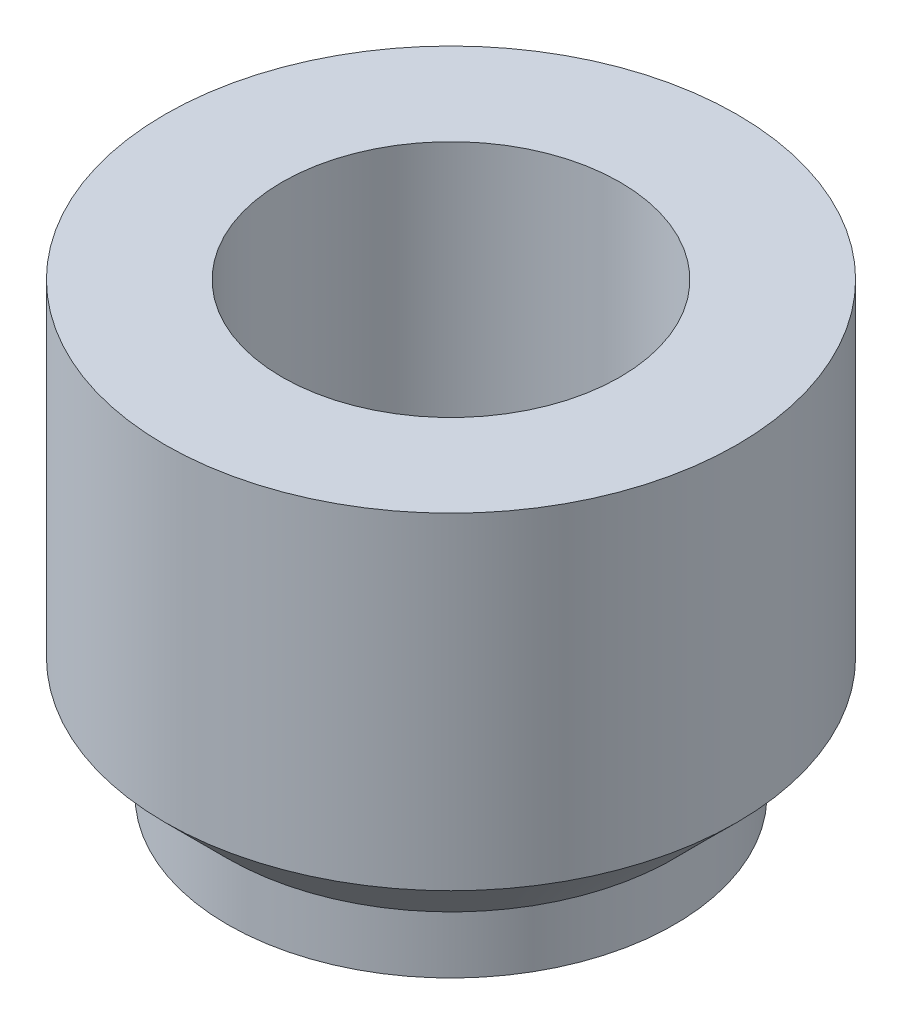
ISO-10303-21;
HEADER;
FILE_DESCRIPTION(('STEP AP214'),'2;1');
FILE_NAME('part.step','',(''),(''),'','','');
FILE_SCHEMA(('AUTOMOTIVE_DESIGN { 1 0 10303 214 1 1 1 1 }'));
ENDSEC;
DATA;
#1=APPLICATION_CONTEXT('core data for automotive mechanical design processes');
#2=APPLICATION_PROTOCOL_DEFINITION('international standard','automotive_design',2000,#1);
#3=PRODUCT_CONTEXT('',#1,'mechanical');
#4=PRODUCT('Part','Part','',(#3));
#5=PRODUCT_RELATED_PRODUCT_CATEGORY('part','',(#4));
#6=PRODUCT_DEFINITION_FORMATION('','',#4);
#7=PRODUCT_DEFINITION_CONTEXT('part definition',#1,'design');
#8=PRODUCT_DEFINITION('design','',#6,#7);
#9=PRODUCT_DEFINITION_SHAPE('','',#8);
#10=(LENGTH_UNIT() NAMED_UNIT(*) SI_UNIT(.MILLI.,.METRE.));
#11=(NAMED_UNIT(*) PLANE_ANGLE_UNIT() SI_UNIT($,.RADIAN.));
#12=(NAMED_UNIT(*) SI_UNIT($,.STERADIAN.) SOLID_ANGLE_UNIT());
#13=UNCERTAINTY_MEASURE_WITH_UNIT(LENGTH_MEASURE(1.E-05),#10,'distance_accuracy_value','');
#14=(GEOMETRIC_REPRESENTATION_CONTEXT(3) GLOBAL_UNCERTAINTY_ASSIGNED_CONTEXT((#13)) GLOBAL_UNIT_ASSIGNED_CONTEXT((#10,
#11,#12)) REPRESENTATION_CONTEXT('',''));
#15=CARTESIAN_POINT('',(0.,0.,0.));
#16=DIRECTION('',(0.,0.,1.));
#17=DIRECTION('',(1.,0.,0.));
#18=AXIS2_PLACEMENT_3D('',#15,#16,#17);
#19=CARTESIAN_POINT('',(0.,0.,0.));
#20=DIRECTION('',(0.,1.,0.));
#21=DIRECTION('',(0.,0.,1.));
#22=AXIS2_PLACEMENT_3D('',#19,#20,#21);
#23=PLANE('',#22);
#24=CARTESIAN_POINT('',(0.,0.,0.));
#25=DIRECTION('',(0.,1.,0.));
#26=DIRECTION('',(0.,0.,1.));
#27=AXIS2_PLACEMENT_3D('',#24,#25,#26);
#28=CIRCLE('',#27,4.1);
#29=CARTESIAN_POINT('',(0.,0.,4.1));
#30=VERTEX_POINT('',#29);
#31=EDGE_CURVE('E59',#30,#30,#28,.T.);
#32=ORIENTED_EDGE('',*,*,#31,.F.);
#33=EDGE_LOOP('',(#32));
#34=FACE_BOUND('',#33,.T.);
#35=CARTESIAN_POINT('',(0.,0.,0.));
#36=DIRECTION('',(0.,1.,0.));
#37=DIRECTION('',(0.,0.,1.));
#38=AXIS2_PLACEMENT_3D('',#35,#36,#37);
#39=CIRCLE('',#38,2.1);
#40=CARTESIAN_POINT('',(0.,0.,2.1));
#41=VERTEX_POINT('',#40);
#42=EDGE_CURVE('E64',#41,#41,#39,.T.);
#43=ORIENTED_EDGE('',*,*,#42,.T.);
#44=EDGE_LOOP('',(#43));
#45=FACE_BOUND('',#44,.T.);
#46=ADVANCED_FACE('F45',(#34,#45),#23,.F.);
#47=CARTESIAN_POINT('',(0.,2.2,0.));
#48=DIRECTION('',(0.,-1.,0.));
#49=DIRECTION('',(0.,0.,-1.));
#50=AXIS2_PLACEMENT_3D('',#47,#48,#49);
#51=CYLINDRICAL_SURFACE('',#50,4.1);
#52=CARTESIAN_POINT('',(0.,1.05,0.));
#53=DIRECTION('',(0.,1.,0.));
#54=DIRECTION('',(0.,0.,1.));
#55=AXIS2_PLACEMENT_3D('',#52,#53,#54);
#56=CIRCLE('',#55,4.1);
#57=CARTESIAN_POINT('',(0.,1.05,4.1));
#58=VERTEX_POINT('',#57);
#59=EDGE_CURVE('E10',#58,#58,#56,.F.);
#60=ORIENTED_EDGE('',*,*,#59,.T.);
#61=EDGE_LOOP('',(#60));
#62=FACE_BOUND('',#61,.T.);
#63=ORIENTED_EDGE('',*,*,#31,.T.);
#64=EDGE_LOOP('',(#63));
#65=FACE_BOUND('',#64,.T.);
#66=ADVANCED_FACE('F105',(#62,#65),#51,.T.);
#67=CARTESIAN_POINT('',(0.,2.2,0.));
#68=DIRECTION('',(0.,-1.,0.));
#69=DIRECTION('',(0.,0.,-1.));
#70=AXIS2_PLACEMENT_3D('',#67,#68,#69);
#71=CYLINDRICAL_SURFACE('',#70,2.1);
#72=CARTESIAN_POINT('',(0.,2.2,0.));
#73=DIRECTION('',(0.,1.,0.));
#74=DIRECTION('',(0.,0.,1.));
#75=AXIS2_PLACEMENT_3D('',#72,#73,#74);
#76=CIRCLE('',#75,2.1);
#77=CARTESIAN_POINT('',(0.,2.2,2.1));
#78=VERTEX_POINT('',#77);
#79=EDGE_CURVE('E70',#78,#78,#76,.T.);
#80=ORIENTED_EDGE('',*,*,#79,.T.);
#81=EDGE_LOOP('',(#80));
#82=FACE_BOUND('',#81,.T.);
#83=ORIENTED_EDGE('',*,*,#42,.F.);
#84=EDGE_LOOP('',(#83));
#85=FACE_BOUND('',#84,.T.);
#86=ADVANCED_FACE('F112',(#82,#85),#71,.F.);
#87=CARTESIAN_POINT('',(0.,2.2,0.));
#88=DIRECTION('',(0.,1.,0.));
#89=DIRECTION('',(0.,0.,1.));
#90=AXIS2_PLACEMENT_3D('',#87,#88,#89);
#91=PLANE('',#90);
#92=ORIENTED_EDGE('',*,*,#79,.F.);
#93=EDGE_LOOP('',(#92));
#94=FACE_BOUND('',#93,.T.);
#95=ADVANCED_FACE('F100',(#94),#91,.F.);
#96=CARTESIAN_POINT('',(0.,3.2,0.));
#97=DIRECTION('',(0.,-1.,0.));
#98=DIRECTION('',(0.,0.,-1.));
#99=AXIS2_PLACEMENT_3D('',#96,#97,#98);
#100=CYLINDRICAL_SURFACE('',#99,5.25);
#101=CARTESIAN_POINT('',(0.,2.2,0.));
#102=DIRECTION('',(0.,1.,0.));
#103=DIRECTION('',(0.,0.,1.));
#104=AXIS2_PLACEMENT_3D('',#101,#102,#103);
#105=CIRCLE('',#104,5.25);
#106=CARTESIAN_POINT('',(0.,2.2,5.25));
#107=VERTEX_POINT('',#106);
#108=EDGE_CURVE('E74',#107,#107,#105,.T.);
#109=ORIENTED_EDGE('',*,*,#108,.T.);
#110=EDGE_LOOP('',(#109));
#111=FACE_BOUND('',#110,.T.);
#112=CARTESIAN_POINT('',(0.,8.2,0.));
#113=DIRECTION('',(0.,1.,0.));
#114=DIRECTION('',(0.,0.,1.));
#115=AXIS2_PLACEMENT_3D('',#112,#113,#114);
#116=CIRCLE('',#115,5.25);
#117=CARTESIAN_POINT('',(0.,8.2,5.25));
#118=VERTEX_POINT('',#117);
#119=EDGE_CURVE('E78',#118,#118,#116,.T.);
#120=ORIENTED_EDGE('',*,*,#119,.F.);
#121=EDGE_LOOP('',(#120));
#122=FACE_BOUND('',#121,.T.);
#123=ADVANCED_FACE('F91',(#111,#122),#100,.T.);
#124=CARTESIAN_POINT('',(0.,8.2,0.));
#125=DIRECTION('',(0.,1.,0.));
#126=DIRECTION('',(0.,0.,1.));
#127=AXIS2_PLACEMENT_3D('',#124,#125,#126);
#128=PLANE('',#127);
#129=ORIENTED_EDGE('',*,*,#119,.T.);
#130=EDGE_LOOP('',(#129));
#131=FACE_BOUND('',#130,.T.);
#132=CARTESIAN_POINT('',(0.,8.2,0.));
#133=DIRECTION('',(0.,1.,0.));
#134=DIRECTION('',(0.,0.,1.));
#135=AXIS2_PLACEMENT_3D('',#132,#133,#134);
#136=CIRCLE('',#135,3.1);
#137=CARTESIAN_POINT('',(0.,8.2,3.1));
#138=VERTEX_POINT('',#137);
#139=EDGE_CURVE('E82',#138,#138,#136,.T.);
#140=ORIENTED_EDGE('',*,*,#139,.F.);
#141=EDGE_LOOP('',(#140));
#142=FACE_BOUND('',#141,.T.);
#143=ADVANCED_FACE('F89',(#131,#142),#128,.T.);
#144=CARTESIAN_POINT('',(0.,8.2,0.));
#145=DIRECTION('',(0.,-1.,0.));
#146=DIRECTION('',(0.,0.,-1.));
#147=AXIS2_PLACEMENT_3D('',#144,#145,#146);
#148=CYLINDRICAL_SURFACE('',#147,3.1);
#149=ORIENTED_EDGE('',*,*,#139,.T.);
#150=EDGE_LOOP('',(#149));
#151=FACE_BOUND('',#150,.T.);
#152=CARTESIAN_POINT('',(0.,3.2,0.));
#153=DIRECTION('',(0.,1.,0.));
#154=DIRECTION('',(0.,0.,1.));
#155=AXIS2_PLACEMENT_3D('',#152,#153,#154);
#156=CIRCLE('',#155,3.1);
#157=CARTESIAN_POINT('',(0.,3.2,3.1));
#158=VERTEX_POINT('',#157);
#159=EDGE_CURVE('E54',#158,#158,#156,.F.);
#160=ORIENTED_EDGE('',*,*,#159,.T.);
#161=EDGE_LOOP('',(#160));
#162=FACE_BOUND('',#161,.T.);
#163=ADVANCED_FACE('F87',(#151,#162),#148,.F.);
#164=CARTESIAN_POINT('',(0.,3.2,0.));
#165=DIRECTION('',(0.,1.,0.));
#166=DIRECTION('',(0.,0.,1.));
#167=AXIS2_PLACEMENT_3D('',#164,#165,#166);
#168=PLANE('',#167);
#169=ORIENTED_EDGE('',*,*,#159,.F.);
#170=EDGE_LOOP('',(#169));
#171=FACE_BOUND('',#170,.T.);
#172=ADVANCED_FACE('F98',(#171),#168,.T.);
#173=CARTESIAN_POINT('',(0.,2.2,0.));
#174=DIRECTION('',(0.,1.,0.));
#175=DIRECTION('',(0.,0.,1.));
#176=AXIS2_PLACEMENT_3D('',#173,#174,#175);
#177=CONICAL_SURFACE('',#176,5.25000000000001,0.785398163397454);
#178=ORIENTED_EDGE('',*,*,#59,.F.);
#179=EDGE_LOOP('',(#178));
#180=FACE_BOUND('',#179,.T.);
#181=ORIENTED_EDGE('',*,*,#108,.F.);
#182=EDGE_LOOP('',(#181));
#183=FACE_BOUND('',#182,.T.);
#184=ADVANCED_FACE('F48',(#180,#183),#177,.T.);
#185=CLOSED_SHELL('',(#46,#66,#86,#95,#123,#143,#163,#172,#184));
#186=MANIFOLD_SOLID_BREP('B2',#185);
#187=ADVANCED_BREP_SHAPE_REPRESENTATION('',(#18,#186),#14);
#188=SHAPE_DEFINITION_REPRESENTATION(#9,#187);
ENDSEC;
END-ISO-10303-21;
